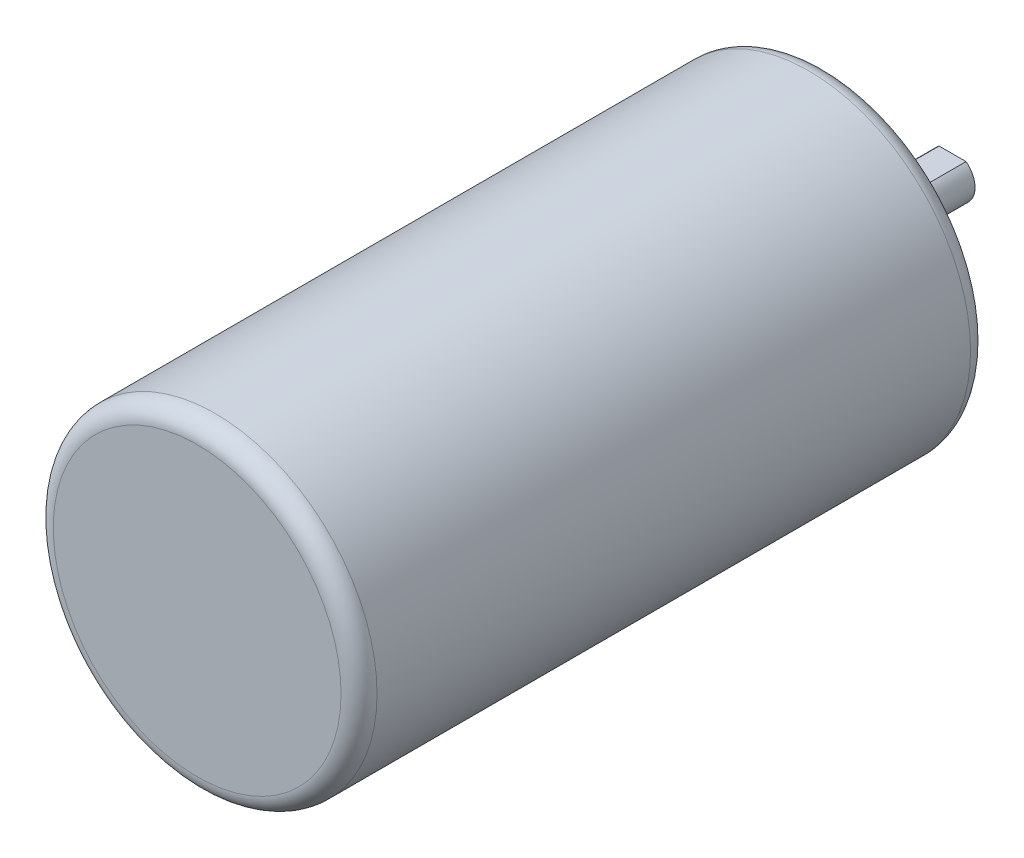
ISO-10303-21;
HEADER;
FILE_DESCRIPTION(('STEP AP214'),'2;1');
FILE_NAME('part.step','',(''),(''),'','','');
FILE_SCHEMA(('AUTOMOTIVE_DESIGN { 1 0 10303 214 1 1 1 1 }'));
ENDSEC;
DATA;
#1=APPLICATION_CONTEXT('core data for automotive mechanical design processes');
#2=APPLICATION_PROTOCOL_DEFINITION('international standard','automotive_design',2000,#1);
#3=PRODUCT_CONTEXT('',#1,'mechanical');
#4=PRODUCT('Part','Part','',(#3));
#5=PRODUCT_RELATED_PRODUCT_CATEGORY('part','',(#4));
#6=PRODUCT_DEFINITION_FORMATION('','',#4);
#7=PRODUCT_DEFINITION_CONTEXT('part definition',#1,'design');
#8=PRODUCT_DEFINITION('design','',#6,#7);
#9=PRODUCT_DEFINITION_SHAPE('','',#8);
#10=(LENGTH_UNIT() NAMED_UNIT(*) SI_UNIT(.MILLI.,.METRE.));
#11=(NAMED_UNIT(*) PLANE_ANGLE_UNIT() SI_UNIT($,.RADIAN.));
#12=(NAMED_UNIT(*) SI_UNIT($,.STERADIAN.) SOLID_ANGLE_UNIT());
#13=UNCERTAINTY_MEASURE_WITH_UNIT(LENGTH_MEASURE(1.E-05),#10,'distance_accuracy_value','');
#14=(GEOMETRIC_REPRESENTATION_CONTEXT(3) GLOBAL_UNCERTAINTY_ASSIGNED_CONTEXT((#13)) GLOBAL_UNIT_ASSIGNED_CONTEXT((#10,
#11,#12)) REPRESENTATION_CONTEXT('',''));
#15=CARTESIAN_POINT('',(0.,0.,0.));
#16=DIRECTION('',(0.,0.,1.));
#17=DIRECTION('',(1.,0.,0.));
#18=AXIS2_PLACEMENT_3D('',#15,#16,#17);
#19=CARTESIAN_POINT('',(0.,0.,0.));
#20=DIRECTION('',(0.,0.,1.));
#21=DIRECTION('',(1.,0.,0.));
#22=AXIS2_PLACEMENT_3D('',#19,#20,#21);
#23=PLANE('',#22);
#24=CARTESIAN_POINT('',(0.,0.,0.));
#25=DIRECTION('',(0.,0.,1.));
#26=DIRECTION('',(1.,0.,0.));
#27=AXIS2_PLACEMENT_3D('',#24,#25,#26);
#28=CIRCLE('',#27,16.);
#29=CARTESIAN_POINT('',(16.,0.,0.));
#30=VERTEX_POINT('',#29);
#31=EDGE_CURVE('E11',#30,#30,#28,.F.);
#32=ORIENTED_EDGE('',*,*,#31,.T.);
#33=EDGE_LOOP('',(#32));
#34=FACE_BOUND('',#33,.T.);
#35=CARTESIAN_POINT('',(0.,0.,0.));
#36=DIRECTION('',(0.,0.,-1.));
#37=DIRECTION('',(-1.,0.,0.));
#38=AXIS2_PLACEMENT_3D('',#35,#36,#37);
#39=CIRCLE('',#38,2.5);
#40=CARTESIAN_POINT('',(1.5,2.,0.));
#41=VERTEX_POINT('',#40);
#42=CARTESIAN_POINT('',(-1.5,2.,0.));
#43=VERTEX_POINT('',#42);
#44=EDGE_CURVE('E72',#41,#43,#39,.T.);
#45=ORIENTED_EDGE('',*,*,#44,.F.);
#46=DIRECTION('',(1.,0.,0.));
#47=VECTOR('',#46,1.);
#48=CARTESIAN_POINT('',(1.5,2.,0.));
#49=LINE('',#48,#47);
#50=EDGE_CURVE('E59',#43,#41,#49,.T.);
#51=ORIENTED_EDGE('',*,*,#50,.F.);
#52=EDGE_LOOP('',(#45,#51));
#53=FACE_BOUND('',#52,.T.);
#54=ADVANCED_FACE('F45',(#34,#53),#23,.F.);
#55=CARTESIAN_POINT('',(0.,0.,70.));
#56=DIRECTION('',(0.,0.,-1.));
#57=DIRECTION('',(-1.,0.,0.));
#58=AXIS2_PLACEMENT_3D('',#55,#56,#57);
#59=CYLINDRICAL_SURFACE('',#58,18.);
#60=CARTESIAN_POINT('',(0.,0.,68.));
#61=DIRECTION('',(0.,0.,1.));
#62=DIRECTION('',(1.,0.,0.));
#63=AXIS2_PLACEMENT_3D('',#60,#61,#62);
#64=CIRCLE('',#63,18.);
#65=CARTESIAN_POINT('',(18.,0.,68.));
#66=VERTEX_POINT('',#65);
#67=EDGE_CURVE('E53',#66,#66,#64,.F.);
#68=ORIENTED_EDGE('',*,*,#67,.T.);
#69=EDGE_LOOP('',(#68));
#70=FACE_BOUND('',#69,.T.);
#71=CARTESIAN_POINT('',(0.,0.,2.));
#72=DIRECTION('',(0.,0.,1.));
#73=DIRECTION('',(1.,0.,0.));
#74=AXIS2_PLACEMENT_3D('',#71,#72,#73);
#75=CIRCLE('',#74,18.);
#76=CARTESIAN_POINT('',(18.,0.,2.));
#77=VERTEX_POINT('',#76);
#78=EDGE_CURVE('E92',#77,#77,#75,.T.);
#79=ORIENTED_EDGE('',*,*,#78,.T.);
#80=EDGE_LOOP('',(#79));
#81=FACE_BOUND('',#80,.T.);
#82=ADVANCED_FACE('F97',(#70,#81),#59,.T.);
#83=CARTESIAN_POINT('',(0.,0.,70.));
#84=DIRECTION('',(0.,0.,1.));
#85=DIRECTION('',(1.,0.,0.));
#86=AXIS2_PLACEMENT_3D('',#83,#84,#85);
#87=PLANE('',#86);
#88=CARTESIAN_POINT('',(0.,0.,70.));
#89=DIRECTION('',(0.,0.,1.));
#90=DIRECTION('',(1.,0.,0.));
#91=AXIS2_PLACEMENT_3D('',#88,#89,#90);
#92=CIRCLE('',#91,16.);
#93=CARTESIAN_POINT('',(16.,0.,70.));
#94=VERTEX_POINT('',#93);
#95=EDGE_CURVE('E86',#94,#94,#92,.T.);
#96=ORIENTED_EDGE('',*,*,#95,.T.);
#97=EDGE_LOOP('',(#96));
#98=FACE_BOUND('',#97,.T.);
#99=ADVANCED_FACE('F106',(#98),#87,.T.);
#100=CARTESIAN_POINT('',(0.,0.,-14.));
#101=DIRECTION('',(0.,0.,1.));
#102=DIRECTION('',(1.,0.,0.));
#103=AXIS2_PLACEMENT_3D('',#100,#101,#102);
#104=CYLINDRICAL_SURFACE('',#103,2.5);
#105=ORIENTED_EDGE('',*,*,#44,.T.);
#106=DIRECTION('',(0.,0.,1.));
#107=VECTOR('',#106,1.);
#108=CARTESIAN_POINT('',(-1.5,2.,-14.));
#109=LINE('',#108,#107);
#110=CARTESIAN_POINT('',(-1.5,2.,-14.));
#111=VERTEX_POINT('',#110);
#112=EDGE_CURVE('E81',#111,#43,#109,.T.);
#113=ORIENTED_EDGE('',*,*,#112,.F.);
#114=CARTESIAN_POINT('',(0.,0.,-14.));
#115=DIRECTION('',(0.,0.,-1.));
#116=DIRECTION('',(-1.,0.,0.));
#117=AXIS2_PLACEMENT_3D('',#114,#115,#116);
#118=CIRCLE('',#117,2.5);
#119=CARTESIAN_POINT('',(1.5,2.,-14.));
#120=VERTEX_POINT('',#119);
#121=EDGE_CURVE('E82',#120,#111,#118,.T.);
#122=ORIENTED_EDGE('',*,*,#121,.F.);
#123=DIRECTION('',(0.,0.,1.));
#124=VECTOR('',#123,1.);
#125=CARTESIAN_POINT('',(1.5,2.,-14.));
#126=LINE('',#125,#124);
#127=EDGE_CURVE('E79',#120,#41,#126,.T.);
#128=ORIENTED_EDGE('',*,*,#127,.T.);
#129=EDGE_LOOP('',(#105,#113,#122,#128));
#130=FACE_BOUND('',#129,.T.);
#131=ADVANCED_FACE('F84',(#130),#104,.T.);
#132=CARTESIAN_POINT('',(1.5,2.,-14.));
#133=DIRECTION('',(0.,-1.,0.));
#134=DIRECTION('',(0.,0.,-1.));
#135=AXIS2_PLACEMENT_3D('',#132,#133,#134);
#136=PLANE('',#135);
#137=ORIENTED_EDGE('',*,*,#50,.T.);
#138=ORIENTED_EDGE('',*,*,#127,.F.);
#139=DIRECTION('',(1.,0.,0.));
#140=VECTOR('',#139,1.);
#141=CARTESIAN_POINT('',(1.5,2.,-14.));
#142=LINE('',#141,#140);
#143=EDGE_CURVE('E67',#111,#120,#142,.T.);
#144=ORIENTED_EDGE('',*,*,#143,.F.);
#145=ORIENTED_EDGE('',*,*,#112,.T.);
#146=EDGE_LOOP('',(#137,#138,#144,#145));
#147=FACE_BOUND('',#146,.T.);
#148=ADVANCED_FACE('F78',(#147),#136,.F.);
#149=CARTESIAN_POINT('',(0.,0.,-14.));
#150=DIRECTION('',(0.,0.,-1.));
#151=DIRECTION('',(-1.,0.,0.));
#152=AXIS2_PLACEMENT_3D('',#149,#150,#151);
#153=PLANE('',#152);
#154=ORIENTED_EDGE('',*,*,#121,.T.);
#155=ORIENTED_EDGE('',*,*,#143,.T.);
#156=EDGE_LOOP('',(#154,#155));
#157=FACE_BOUND('',#156,.T.);
#158=ADVANCED_FACE('F103',(#157),#153,.T.);
#159=CARTESIAN_POINT('',(0.,0.,68.));
#160=DIRECTION('',(0.,0.,1.));
#161=DIRECTION('',(1.,0.,0.));
#162=AXIS2_PLACEMENT_3D('',#159,#160,#161);
#163=TOROIDAL_SURFACE('',#162,16.,2.);
#164=ORIENTED_EDGE('',*,*,#67,.F.);
#165=EDGE_LOOP('',(#164));
#166=FACE_BOUND('',#165,.T.);
#167=ORIENTED_EDGE('',*,*,#95,.F.);
#168=EDGE_LOOP('',(#167));
#169=FACE_BOUND('',#168,.T.);
#170=ADVANCED_FACE('F100',(#166,#169),#163,.T.);
#171=CARTESIAN_POINT('',(0.,0.,2.));
#172=DIRECTION('',(0.,0.,1.));
#173=DIRECTION('',(1.,0.,0.));
#174=AXIS2_PLACEMENT_3D('',#171,#172,#173);
#175=TOROIDAL_SURFACE('',#174,16.,2.);
#176=ORIENTED_EDGE('',*,*,#31,.F.);
#177=EDGE_LOOP('',(#176));
#178=FACE_BOUND('',#177,.T.);
#179=ORIENTED_EDGE('',*,*,#78,.F.);
#180=EDGE_LOOP('',(#179));
#181=FACE_BOUND('',#180,.T.);
#182=ADVANCED_FACE('F47',(#178,#181),#175,.T.);
#183=CLOSED_SHELL('',(#54,#82,#99,#131,#148,#158,#170,#182));
#184=MANIFOLD_SOLID_BREP('B2',#183);
#185=ADVANCED_BREP_SHAPE_REPRESENTATION('',(#18,#184),#14);
#186=SHAPE_DEFINITION_REPRESENTATION(#9,#185);
ENDSEC;
END-ISO-10303-21;
